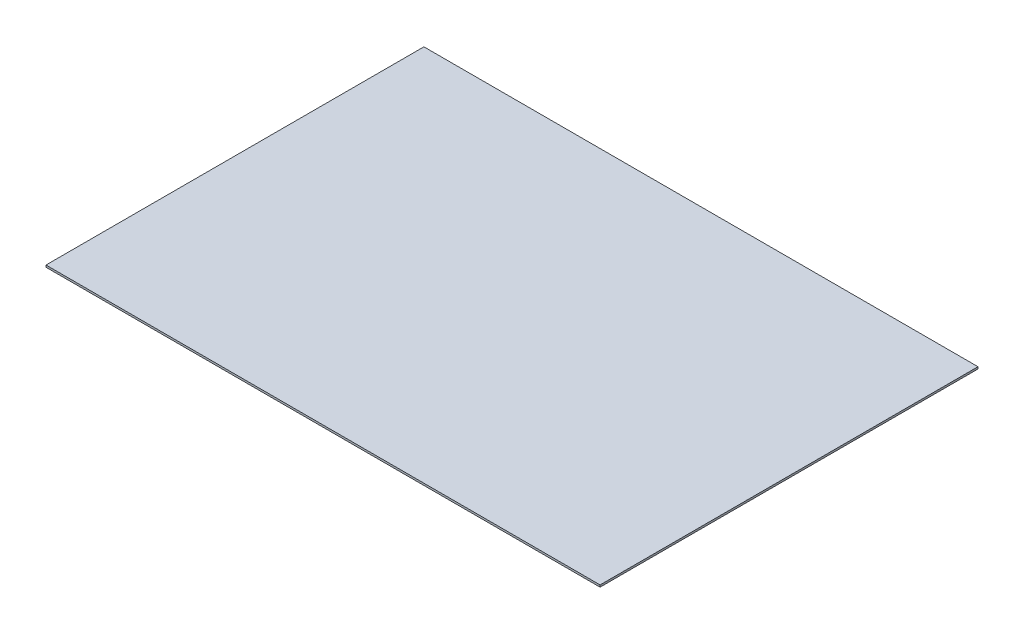
ISO-10303-21;
HEADER;
FILE_DESCRIPTION(('STEP AP214'),'2;1');
FILE_NAME('part.step','',(''),(''),'','','');
FILE_SCHEMA(('AUTOMOTIVE_DESIGN { 1 0 10303 214 1 1 1 1 }'));
ENDSEC;
DATA;
#1=APPLICATION_CONTEXT('core data for automotive mechanical design processes');
#2=APPLICATION_PROTOCOL_DEFINITION('international standard','automotive_design',2000,#1);
#3=PRODUCT_CONTEXT('',#1,'mechanical');
#4=PRODUCT('Part','Part','',(#3));
#5=PRODUCT_RELATED_PRODUCT_CATEGORY('part','',(#4));
#6=PRODUCT_DEFINITION_FORMATION('','',#4);
#7=PRODUCT_DEFINITION_CONTEXT('part definition',#1,'design');
#8=PRODUCT_DEFINITION('design','',#6,#7);
#9=PRODUCT_DEFINITION_SHAPE('','',#8);
#10=(LENGTH_UNIT() NAMED_UNIT(*) SI_UNIT(.MILLI.,.METRE.));
#11=(NAMED_UNIT(*) PLANE_ANGLE_UNIT() SI_UNIT($,.RADIAN.));
#12=(NAMED_UNIT(*) SI_UNIT($,.STERADIAN.) SOLID_ANGLE_UNIT());
#13=UNCERTAINTY_MEASURE_WITH_UNIT(LENGTH_MEASURE(1.E-05),#10,'distance_accuracy_value','');
#14=(GEOMETRIC_REPRESENTATION_CONTEXT(3) GLOBAL_UNCERTAINTY_ASSIGNED_CONTEXT((#13)) GLOBAL_UNIT_ASSIGNED_CONTEXT((#10,
#11,#12)) REPRESENTATION_CONTEXT('',''));
#15=CARTESIAN_POINT('',(0.,0.,0.));
#16=DIRECTION('',(0.,0.,1.));
#17=DIRECTION('',(1.,0.,0.));
#18=AXIS2_PLACEMENT_3D('',#15,#16,#17);
#19=CARTESIAN_POINT('',(893.7625,6.35,609.6));
#20=DIRECTION('',(-1.,0.,0.));
#21=DIRECTION('',(0.,0.,1.));
#22=AXIS2_PLACEMENT_3D('',#19,#20,#21);
#23=PLANE('',#22);
#24=DIRECTION('',(0.,0.,-1.));
#25=VECTOR('',#24,1.);
#26=CARTESIAN_POINT('',(893.7625,0.,609.6));
#27=LINE('',#26,#25);
#28=CARTESIAN_POINT('',(893.7625,0.,609.6));
#29=VERTEX_POINT('',#28);
#30=CARTESIAN_POINT('',(893.7625,0.,-609.6));
#31=VERTEX_POINT('',#30);
#32=EDGE_CURVE('E110',#29,#31,#27,.T.);
#33=ORIENTED_EDGE('',*,*,#32,.T.);
#34=DIRECTION('',(0.,-1.,0.));
#35=VECTOR('',#34,1.);
#36=CARTESIAN_POINT('',(893.7625,6.35,-609.6));
#37=LINE('',#36,#35);
#38=CARTESIAN_POINT('',(893.7625,6.35,-609.6));
#39=VERTEX_POINT('',#38);
#40=EDGE_CURVE('E11',#39,#31,#37,.T.);
#41=ORIENTED_EDGE('',*,*,#40,.F.);
#42=DIRECTION('',(0.,0.,-1.));
#43=VECTOR('',#42,1.);
#44=CARTESIAN_POINT('',(893.7625,6.35,609.6));
#45=LINE('',#44,#43);
#46=CARTESIAN_POINT('',(893.7625,6.35,609.6));
#47=VERTEX_POINT('',#46);
#48=EDGE_CURVE('E94',#47,#39,#45,.T.);
#49=ORIENTED_EDGE('',*,*,#48,.F.);
#50=DIRECTION('',(0.,-1.,0.));
#51=VECTOR('',#50,1.);
#52=CARTESIAN_POINT('',(893.7625,6.35,609.6));
#53=LINE('',#52,#51);
#54=EDGE_CURVE('E106',#47,#29,#53,.T.);
#55=ORIENTED_EDGE('',*,*,#54,.T.);
#56=EDGE_LOOP('',(#33,#41,#49,#55));
#57=FACE_BOUND('',#56,.T.);
#58=ADVANCED_FACE('F42',(#57),#23,.F.);
#59=CARTESIAN_POINT('',(-893.7625,6.35,-609.6));
#60=DIRECTION('',(0.,0.,1.));
#61=DIRECTION('',(1.,0.,0.));
#62=AXIS2_PLACEMENT_3D('',#59,#60,#61);
#63=PLANE('',#62);
#64=DIRECTION('',(-1.,0.,0.));
#65=VECTOR('',#64,1.);
#66=CARTESIAN_POINT('',(-893.7625,0.,-609.6));
#67=LINE('',#66,#65);
#68=CARTESIAN_POINT('',(-893.7625,0.,-609.6));
#69=VERTEX_POINT('',#68);
#70=EDGE_CURVE('E99',#31,#69,#67,.T.);
#71=ORIENTED_EDGE('',*,*,#70,.T.);
#72=DIRECTION('',(0.,-1.,0.));
#73=VECTOR('',#72,1.);
#74=CARTESIAN_POINT('',(-893.7625,6.35,-609.6));
#75=LINE('',#74,#73);
#76=CARTESIAN_POINT('',(-893.7625,6.35,-609.6));
#77=VERTEX_POINT('',#76);
#78=EDGE_CURVE('E51',#77,#69,#75,.T.);
#79=ORIENTED_EDGE('',*,*,#78,.F.);
#80=DIRECTION('',(-1.,0.,0.));
#81=VECTOR('',#80,1.);
#82=CARTESIAN_POINT('',(-893.7625,6.35,-609.6));
#83=LINE('',#82,#81);
#84=EDGE_CURVE('E89',#39,#77,#83,.T.);
#85=ORIENTED_EDGE('',*,*,#84,.F.);
#86=ORIENTED_EDGE('',*,*,#40,.T.);
#87=EDGE_LOOP('',(#71,#79,#85,#86));
#88=FACE_BOUND('',#87,.T.);
#89=ADVANCED_FACE('F98',(#88),#63,.F.);
#90=CARTESIAN_POINT('',(-893.7625,6.35,609.6));
#91=DIRECTION('',(1.,0.,0.));
#92=DIRECTION('',(0.,0.,-1.));
#93=AXIS2_PLACEMENT_3D('',#90,#91,#92);
#94=PLANE('',#93);
#95=DIRECTION('',(0.,0.,1.));
#96=VECTOR('',#95,1.);
#97=CARTESIAN_POINT('',(-893.7625,0.,609.6));
#98=LINE('',#97,#96);
#99=CARTESIAN_POINT('',(-893.7625,0.,609.6));
#100=VERTEX_POINT('',#99);
#101=EDGE_CURVE('E76',#69,#100,#98,.T.);
#102=ORIENTED_EDGE('',*,*,#101,.T.);
#103=DIRECTION('',(0.,-1.,0.));
#104=VECTOR('',#103,1.);
#105=CARTESIAN_POINT('',(-893.7625,6.35,609.6));
#106=LINE('',#105,#104);
#107=CARTESIAN_POINT('',(-893.7625,6.35,609.6));
#108=VERTEX_POINT('',#107);
#109=EDGE_CURVE('E101',#108,#100,#106,.T.);
#110=ORIENTED_EDGE('',*,*,#109,.F.);
#111=DIRECTION('',(0.,0.,1.));
#112=VECTOR('',#111,1.);
#113=CARTESIAN_POINT('',(-893.7625,6.35,609.6));
#114=LINE('',#113,#112);
#115=EDGE_CURVE('E92',#77,#108,#114,.T.);
#116=ORIENTED_EDGE('',*,*,#115,.F.);
#117=ORIENTED_EDGE('',*,*,#78,.T.);
#118=EDGE_LOOP('',(#102,#110,#116,#117));
#119=FACE_BOUND('',#118,.T.);
#120=ADVANCED_FACE('F102',(#119),#94,.F.);
#121=CARTESIAN_POINT('',(-893.7625,6.35,609.6));
#122=DIRECTION('',(0.,0.,-1.));
#123=DIRECTION('',(-1.,0.,0.));
#124=AXIS2_PLACEMENT_3D('',#121,#122,#123);
#125=PLANE('',#124);
#126=DIRECTION('',(1.,0.,0.));
#127=VECTOR('',#126,1.);
#128=CARTESIAN_POINT('',(-893.7625,0.,609.6));
#129=LINE('',#128,#127);
#130=EDGE_CURVE('E82',#100,#29,#129,.T.);
#131=ORIENTED_EDGE('',*,*,#130,.T.);
#132=ORIENTED_EDGE('',*,*,#54,.F.);
#133=DIRECTION('',(1.,0.,0.));
#134=VECTOR('',#133,1.);
#135=CARTESIAN_POINT('',(-893.7625,6.35,609.6));
#136=LINE('',#135,#134);
#137=EDGE_CURVE('E59',#108,#47,#136,.T.);
#138=ORIENTED_EDGE('',*,*,#137,.F.);
#139=ORIENTED_EDGE('',*,*,#109,.T.);
#140=EDGE_LOOP('',(#131,#132,#138,#139));
#141=FACE_BOUND('',#140,.T.);
#142=ADVANCED_FACE('F123',(#141),#125,.F.);
#143=CARTESIAN_POINT('',(0.,6.35,0.));
#144=DIRECTION('',(0.,-1.,0.));
#145=DIRECTION('',(0.,0.,-1.));
#146=AXIS2_PLACEMENT_3D('',#143,#144,#145);
#147=PLANE('',#146);
#148=ORIENTED_EDGE('',*,*,#48,.T.);
#149=ORIENTED_EDGE('',*,*,#84,.T.);
#150=ORIENTED_EDGE('',*,*,#115,.T.);
#151=ORIENTED_EDGE('',*,*,#137,.T.);
#152=EDGE_LOOP('',(#148,#149,#150,#151));
#153=FACE_BOUND('',#152,.T.);
#154=ADVANCED_FACE('F90',(#153),#147,.F.);
#155=CARTESIAN_POINT('',(0.,0.,0.));
#156=DIRECTION('',(0.,-1.,0.));
#157=DIRECTION('',(0.,0.,-1.));
#158=AXIS2_PLACEMENT_3D('',#155,#156,#157);
#159=PLANE('',#158);
#160=ORIENTED_EDGE('',*,*,#32,.F.);
#161=ORIENTED_EDGE('',*,*,#130,.F.);
#162=ORIENTED_EDGE('',*,*,#101,.F.);
#163=ORIENTED_EDGE('',*,*,#70,.F.);
#164=EDGE_LOOP('',(#160,#161,#162,#163));
#165=FACE_BOUND('',#164,.T.);
#166=ADVANCED_FACE('F126',(#165),#159,.T.);
#167=CLOSED_SHELL('',(#58,#89,#120,#142,#154,#166));
#168=MANIFOLD_SOLID_BREP('B2',#167);
#169=ADVANCED_BREP_SHAPE_REPRESENTATION('',(#18,#168),#14);
#170=SHAPE_DEFINITION_REPRESENTATION(#9,#169);
ENDSEC;
END-ISO-10303-21;
